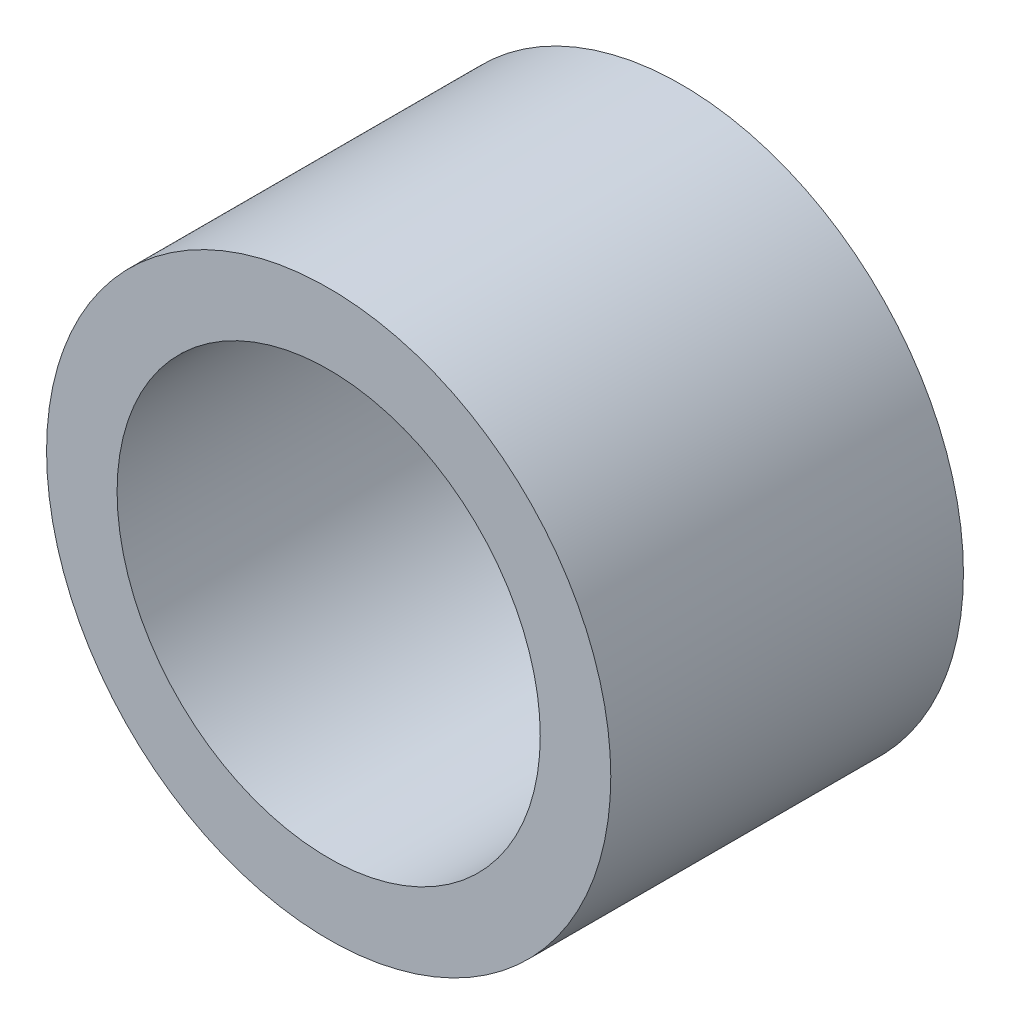
ISO-10303-21;
HEADER;
FILE_DESCRIPTION(('STEP AP214'),'2;1');
FILE_NAME('part.step','',(''),(''),'','','');
FILE_SCHEMA(('AUTOMOTIVE_DESIGN { 1 0 10303 214 1 1 1 1 }'));
ENDSEC;
DATA;
#1=APPLICATION_CONTEXT('core data for automotive mechanical design processes');
#2=APPLICATION_PROTOCOL_DEFINITION('international standard','automotive_design',2000,#1);
#3=PRODUCT_CONTEXT('',#1,'mechanical');
#4=PRODUCT('Part','Part','',(#3));
#5=PRODUCT_RELATED_PRODUCT_CATEGORY('part','',(#4));
#6=PRODUCT_DEFINITION_FORMATION('','',#4);
#7=PRODUCT_DEFINITION_CONTEXT('part definition',#1,'design');
#8=PRODUCT_DEFINITION('design','',#6,#7);
#9=PRODUCT_DEFINITION_SHAPE('','',#8);
#10=(LENGTH_UNIT() NAMED_UNIT(*) SI_UNIT(.MILLI.,.METRE.));
#11=(NAMED_UNIT(*) PLANE_ANGLE_UNIT() SI_UNIT($,.RADIAN.));
#12=(NAMED_UNIT(*) SI_UNIT($,.STERADIAN.) SOLID_ANGLE_UNIT());
#13=UNCERTAINTY_MEASURE_WITH_UNIT(LENGTH_MEASURE(1.E-05),#10,'distance_accuracy_value','');
#14=(GEOMETRIC_REPRESENTATION_CONTEXT(3) GLOBAL_UNCERTAINTY_ASSIGNED_CONTEXT((#13)) GLOBAL_UNIT_ASSIGNED_CONTEXT((#10,
#11,#12)) REPRESENTATION_CONTEXT('',''));
#15=CARTESIAN_POINT('',(0.,0.,0.));
#16=DIRECTION('',(0.,0.,1.));
#17=DIRECTION('',(1.,0.,0.));
#18=AXIS2_PLACEMENT_3D('',#15,#16,#17);
#19=CARTESIAN_POINT('',(0.,0.,7.5));
#20=DIRECTION('',(0.,0.,1.));
#21=DIRECTION('',(1.,0.,0.));
#22=AXIS2_PLACEMENT_3D('',#19,#20,#21);
#23=PLANE('',#22);
#24=CARTESIAN_POINT('',(0.,0.,7.5));
#25=DIRECTION('',(0.,0.,1.));
#26=DIRECTION('',(1.,0.,0.));
#27=AXIS2_PLACEMENT_3D('',#24,#25,#26);
#28=CIRCLE('',#27,6.);
#29=CARTESIAN_POINT('',(6.,0.,7.5));
#30=VERTEX_POINT('',#29);
#31=EDGE_CURVE('E10',#30,#30,#28,.T.);
#32=ORIENTED_EDGE('',*,*,#31,.T.);
#33=EDGE_LOOP('',(#32));
#34=FACE_BOUND('',#33,.T.);
#35=CARTESIAN_POINT('',(0.,0.,7.5));
#36=DIRECTION('',(0.,0.,1.));
#37=DIRECTION('',(1.,0.,0.));
#38=AXIS2_PLACEMENT_3D('',#35,#36,#37);
#39=CIRCLE('',#38,4.5);
#40=CARTESIAN_POINT('',(4.5,0.,7.5));
#41=VERTEX_POINT('',#40);
#42=EDGE_CURVE('E42',#41,#41,#39,.T.);
#43=ORIENTED_EDGE('',*,*,#42,.F.);
#44=EDGE_LOOP('',(#43));
#45=FACE_BOUND('',#44,.T.);
#46=ADVANCED_FACE('F31',(#34,#45),#23,.T.);
#47=CARTESIAN_POINT('',(0.,0.,0.));
#48=DIRECTION('',(0.,0.,1.));
#49=DIRECTION('',(1.,0.,0.));
#50=AXIS2_PLACEMENT_3D('',#47,#48,#49);
#51=PLANE('',#50);
#52=CARTESIAN_POINT('',(0.,0.,0.));
#53=DIRECTION('',(0.,0.,1.));
#54=DIRECTION('',(1.,0.,0.));
#55=AXIS2_PLACEMENT_3D('',#52,#53,#54);
#56=CIRCLE('',#55,6.);
#57=CARTESIAN_POINT('',(6.,0.,0.));
#58=VERTEX_POINT('',#57);
#59=EDGE_CURVE('E35',#58,#58,#56,.T.);
#60=ORIENTED_EDGE('',*,*,#59,.F.);
#61=EDGE_LOOP('',(#60));
#62=FACE_BOUND('',#61,.T.);
#63=CARTESIAN_POINT('',(0.,0.,0.));
#64=DIRECTION('',(0.,0.,1.));
#65=DIRECTION('',(1.,0.,0.));
#66=AXIS2_PLACEMENT_3D('',#63,#64,#65);
#67=CIRCLE('',#66,4.5);
#68=CARTESIAN_POINT('',(4.5,0.,0.));
#69=VERTEX_POINT('',#68);
#70=EDGE_CURVE('E44',#69,#69,#67,.T.);
#71=ORIENTED_EDGE('',*,*,#70,.T.);
#72=EDGE_LOOP('',(#71));
#73=FACE_BOUND('',#72,.T.);
#74=ADVANCED_FACE('F54',(#62,#73),#51,.F.);
#75=CARTESIAN_POINT('',(0.,0.,7.5));
#76=DIRECTION('',(0.,0.,-1.));
#77=DIRECTION('',(-1.,0.,0.));
#78=AXIS2_PLACEMENT_3D('',#75,#76,#77);
#79=CYLINDRICAL_SURFACE('',#78,6.);
#80=ORIENTED_EDGE('',*,*,#31,.F.);
#81=EDGE_LOOP('',(#80));
#82=FACE_BOUND('',#81,.T.);
#83=ORIENTED_EDGE('',*,*,#59,.T.);
#84=EDGE_LOOP('',(#83));
#85=FACE_BOUND('',#84,.T.);
#86=ADVANCED_FACE('F33',(#82,#85),#79,.T.);
#87=CARTESIAN_POINT('',(0.,0.,7.5));
#88=DIRECTION('',(0.,0.,-1.));
#89=DIRECTION('',(-1.,0.,0.));
#90=AXIS2_PLACEMENT_3D('',#87,#88,#89);
#91=CYLINDRICAL_SURFACE('',#90,4.5);
#92=ORIENTED_EDGE('',*,*,#42,.T.);
#93=EDGE_LOOP('',(#92));
#94=FACE_BOUND('',#93,.T.);
#95=ORIENTED_EDGE('',*,*,#70,.F.);
#96=EDGE_LOOP('',(#95));
#97=FACE_BOUND('',#96,.T.);
#98=ADVANCED_FACE('F50',(#94,#97),#91,.F.);
#99=CLOSED_SHELL('',(#46,#74,#86,#98));
#100=MANIFOLD_SOLID_BREP('B2',#99);
#101=ADVANCED_BREP_SHAPE_REPRESENTATION('',(#18,#100),#14);
#102=SHAPE_DEFINITION_REPRESENTATION(#9,#101);
ENDSEC;
END-ISO-10303-21;
